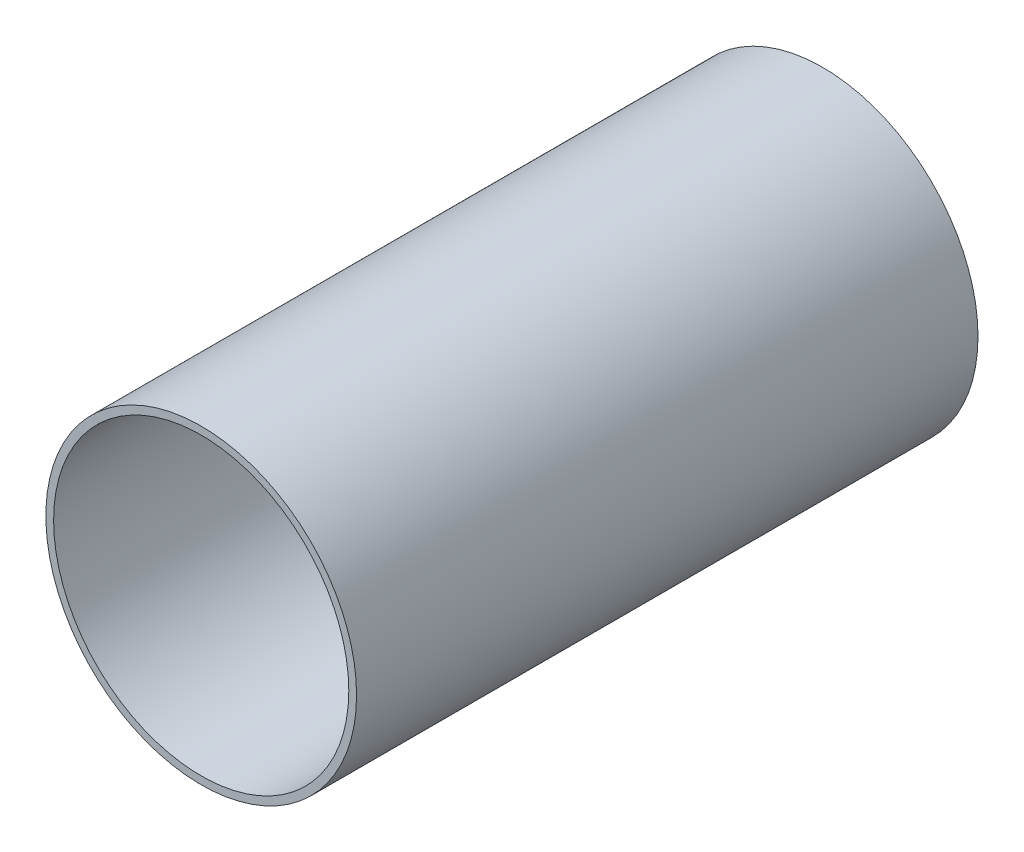
ISO-10303-21;
HEADER;
FILE_DESCRIPTION(('STEP AP214'),'2;1');
FILE_NAME('part.step','',(''),(''),'','','');
FILE_SCHEMA(('AUTOMOTIVE_DESIGN { 1 0 10303 214 1 1 1 1 }'));
ENDSEC;
DATA;
#1=APPLICATION_CONTEXT('core data for automotive mechanical design processes');
#2=APPLICATION_PROTOCOL_DEFINITION('international standard','automotive_design',2000,#1);
#3=PRODUCT_CONTEXT('',#1,'mechanical');
#4=PRODUCT('Part','Part','',(#3));
#5=PRODUCT_RELATED_PRODUCT_CATEGORY('part','',(#4));
#6=PRODUCT_DEFINITION_FORMATION('','',#4);
#7=PRODUCT_DEFINITION_CONTEXT('part definition',#1,'design');
#8=PRODUCT_DEFINITION('design','',#6,#7);
#9=PRODUCT_DEFINITION_SHAPE('','',#8);
#10=(LENGTH_UNIT() NAMED_UNIT(*) SI_UNIT(.MILLI.,.METRE.));
#11=(NAMED_UNIT(*) PLANE_ANGLE_UNIT() SI_UNIT($,.RADIAN.));
#12=(NAMED_UNIT(*) SI_UNIT($,.STERADIAN.) SOLID_ANGLE_UNIT());
#13=UNCERTAINTY_MEASURE_WITH_UNIT(LENGTH_MEASURE(1.E-05),#10,'distance_accuracy_value','');
#14=(GEOMETRIC_REPRESENTATION_CONTEXT(3) GLOBAL_UNCERTAINTY_ASSIGNED_CONTEXT((#13)) GLOBAL_UNIT_ASSIGNED_CONTEXT((#10,
#11,#12)) REPRESENTATION_CONTEXT('',''));
#15=CARTESIAN_POINT('',(0.,0.,0.));
#16=DIRECTION('',(0.,0.,1.));
#17=DIRECTION('',(1.,0.,0.));
#18=AXIS2_PLACEMENT_3D('',#15,#16,#17);
#19=CARTESIAN_POINT('',(0.,0.,40.));
#20=DIRECTION('',(0.,0.,1.));
#21=DIRECTION('',(1.,0.,0.));
#22=AXIS2_PLACEMENT_3D('',#19,#20,#21);
#23=PLANE('',#22);
#24=CARTESIAN_POINT('',(0.,0.,40.));
#25=DIRECTION('',(0.,0.,1.));
#26=DIRECTION('',(1.,0.,0.));
#27=AXIS2_PLACEMENT_3D('',#24,#25,#26);
#28=CIRCLE('',#27,10.);
#29=CARTESIAN_POINT('',(10.,0.,40.));
#30=VERTEX_POINT('',#29);
#31=EDGE_CURVE('E10',#30,#30,#28,.T.);
#32=ORIENTED_EDGE('',*,*,#31,.T.);
#33=EDGE_LOOP('',(#32));
#34=FACE_BOUND('',#33,.T.);
#35=CARTESIAN_POINT('',(0.,0.,40.));
#36=DIRECTION('',(0.,0.,1.));
#37=DIRECTION('',(1.,0.,0.));
#38=AXIS2_PLACEMENT_3D('',#35,#36,#37);
#39=CIRCLE('',#38,9.5);
#40=CARTESIAN_POINT('',(9.5,0.,40.));
#41=VERTEX_POINT('',#40);
#42=EDGE_CURVE('E43',#41,#41,#39,.T.);
#43=ORIENTED_EDGE('',*,*,#42,.F.);
#44=EDGE_LOOP('',(#43));
#45=FACE_BOUND('',#44,.T.);
#46=ADVANCED_FACE('F32',(#34,#45),#23,.T.);
#47=CARTESIAN_POINT('',(0.,0.,0.));
#48=DIRECTION('',(0.,0.,1.));
#49=DIRECTION('',(1.,0.,0.));
#50=AXIS2_PLACEMENT_3D('',#47,#48,#49);
#51=PLANE('',#50);
#52=CARTESIAN_POINT('',(0.,0.,0.));
#53=DIRECTION('',(0.,0.,1.));
#54=DIRECTION('',(1.,0.,0.));
#55=AXIS2_PLACEMENT_3D('',#52,#53,#54);
#56=CIRCLE('',#55,10.);
#57=CARTESIAN_POINT('',(10.,0.,0.));
#58=VERTEX_POINT('',#57);
#59=EDGE_CURVE('E36',#58,#58,#56,.T.);
#60=ORIENTED_EDGE('',*,*,#59,.F.);
#61=EDGE_LOOP('',(#60));
#62=FACE_BOUND('',#61,.T.);
#63=CARTESIAN_POINT('',(0.,0.,0.));
#64=DIRECTION('',(0.,0.,1.));
#65=DIRECTION('',(1.,0.,0.));
#66=AXIS2_PLACEMENT_3D('',#63,#64,#65);
#67=CIRCLE('',#66,9.5);
#68=CARTESIAN_POINT('',(9.5,0.,0.));
#69=VERTEX_POINT('',#68);
#70=EDGE_CURVE('E45',#69,#69,#67,.T.);
#71=ORIENTED_EDGE('',*,*,#70,.T.);
#72=EDGE_LOOP('',(#71));
#73=FACE_BOUND('',#72,.T.);
#74=ADVANCED_FACE('F55',(#62,#73),#51,.F.);
#75=CARTESIAN_POINT('',(0.,0.,40.));
#76=DIRECTION('',(0.,0.,-1.));
#77=DIRECTION('',(-1.,0.,0.));
#78=AXIS2_PLACEMENT_3D('',#75,#76,#77);
#79=CYLINDRICAL_SURFACE('',#78,10.);
#80=ORIENTED_EDGE('',*,*,#31,.F.);
#81=EDGE_LOOP('',(#80));
#82=FACE_BOUND('',#81,.T.);
#83=ORIENTED_EDGE('',*,*,#59,.T.);
#84=EDGE_LOOP('',(#83));
#85=FACE_BOUND('',#84,.T.);
#86=ADVANCED_FACE('F34',(#82,#85),#79,.T.);
#87=CARTESIAN_POINT('',(0.,0.,40.));
#88=DIRECTION('',(0.,0.,-1.));
#89=DIRECTION('',(-1.,0.,0.));
#90=AXIS2_PLACEMENT_3D('',#87,#88,#89);
#91=CYLINDRICAL_SURFACE('',#90,9.5);
#92=ORIENTED_EDGE('',*,*,#42,.T.);
#93=EDGE_LOOP('',(#92));
#94=FACE_BOUND('',#93,.T.);
#95=ORIENTED_EDGE('',*,*,#70,.F.);
#96=EDGE_LOOP('',(#95));
#97=FACE_BOUND('',#96,.T.);
#98=ADVANCED_FACE('F51',(#94,#97),#91,.F.);
#99=CLOSED_SHELL('',(#46,#74,#86,#98));
#100=MANIFOLD_SOLID_BREP('B2',#99);
#101=ADVANCED_BREP_SHAPE_REPRESENTATION('',(#18,#100),#14);
#102=SHAPE_DEFINITION_REPRESENTATION(#9,#101);
ENDSEC;
END-ISO-10303-21;
